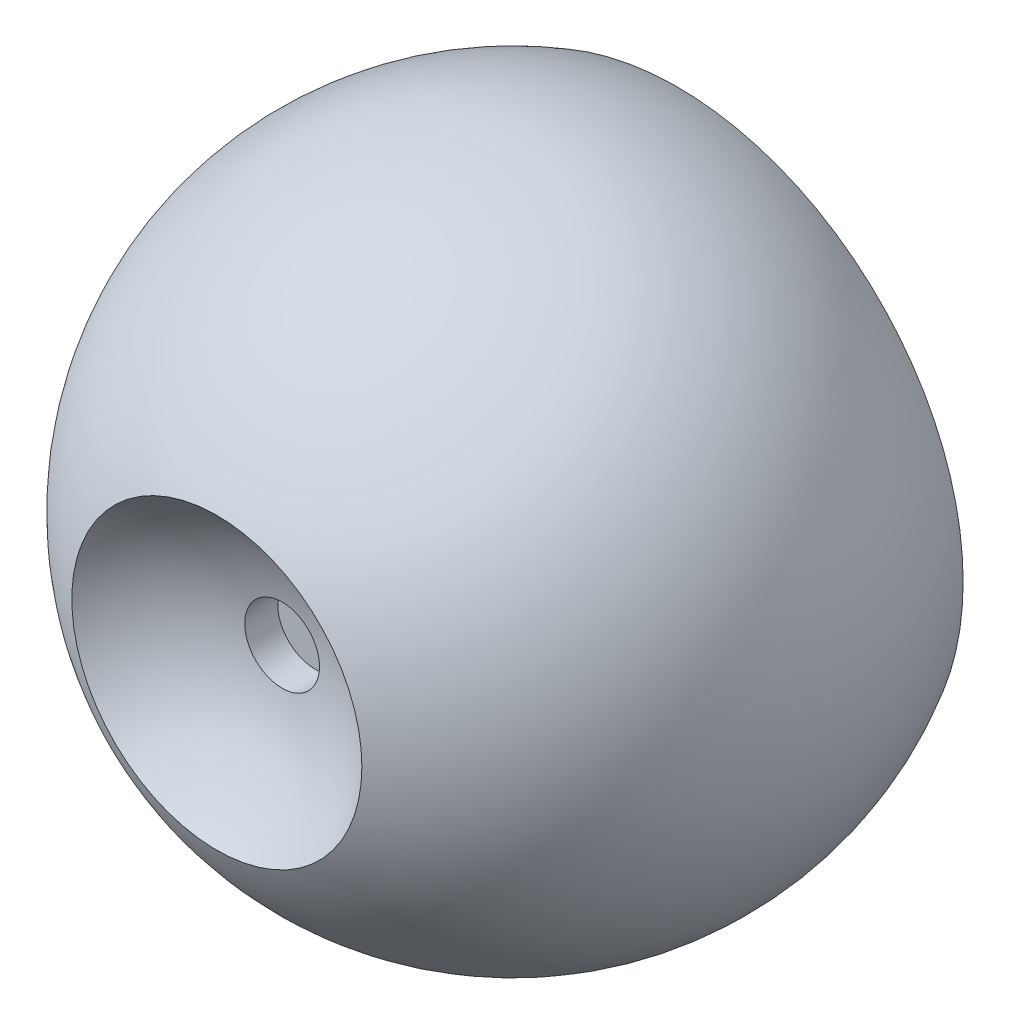
ISO-10303-21;
HEADER;
FILE_DESCRIPTION(('STEP AP214'),'2;1');
FILE_NAME('part.step','',(''),(''),'','','');
FILE_SCHEMA(('AUTOMOTIVE_DESIGN { 1 0 10303 214 1 1 1 1 }'));
ENDSEC;
DATA;
#1=APPLICATION_CONTEXT('core data for automotive mechanical design processes');
#2=APPLICATION_PROTOCOL_DEFINITION('international standard','automotive_design',2000,#1);
#3=PRODUCT_CONTEXT('',#1,'mechanical');
#4=PRODUCT('Part','Part','',(#3));
#5=PRODUCT_RELATED_PRODUCT_CATEGORY('part','',(#4));
#6=PRODUCT_DEFINITION_FORMATION('','',#4);
#7=PRODUCT_DEFINITION_CONTEXT('part definition',#1,'design');
#8=PRODUCT_DEFINITION('design','',#6,#7);
#9=PRODUCT_DEFINITION_SHAPE('','',#8);
#10=(LENGTH_UNIT() NAMED_UNIT(*) SI_UNIT(.MILLI.,.METRE.));
#11=(NAMED_UNIT(*) PLANE_ANGLE_UNIT() SI_UNIT($,.RADIAN.));
#12=(NAMED_UNIT(*) SI_UNIT($,.STERADIAN.) SOLID_ANGLE_UNIT());
#13=UNCERTAINTY_MEASURE_WITH_UNIT(LENGTH_MEASURE(1.E-05),#10,'distance_accuracy_value','');
#14=(GEOMETRIC_REPRESENTATION_CONTEXT(3) GLOBAL_UNCERTAINTY_ASSIGNED_CONTEXT((#13)) GLOBAL_UNIT_ASSIGNED_CONTEXT((#10,
#11,#12)) REPRESENTATION_CONTEXT('',''));
#15=CARTESIAN_POINT('',(0.,0.,0.));
#16=DIRECTION('',(0.,0.,1.));
#17=DIRECTION('',(1.,0.,0.));
#18=AXIS2_PLACEMENT_3D('',#15,#16,#17);
#19=CARTESIAN_POINT('',(-65.,12.9903810567666,-7.5));
#20=DIRECTION('',(0.,0.,1.));
#21=DIRECTION('',(1.,0.,0.));
#22=AXIS2_PLACEMENT_3D('',#19,#20,#21);
#23=PLANE('',#22);
#24=CARTESIAN_POINT('',(-65.,0.,-7.5));
#25=DIRECTION('',(0.,0.,1.));
#26=DIRECTION('',(0.,-1.,0.));
#27=AXIS2_PLACEMENT_3D('',#24,#25,#26);
#28=CIRCLE('',#27,11.9903800262387);
#29=CARTESIAN_POINT('',(-76.9743360660473,-0.620091657600614,-7.5));
#30=VERTEX_POINT('',#29);
#31=CARTESIAN_POINT('',(-76.9740808785671,0.625,-7.5));
#32=VERTEX_POINT('',#31);
#33=EDGE_CURVE('E11',#30,#32,#28,.T.);
#34=ORIENTED_EDGE('',*,*,#33,.T.);
#35=DIRECTION('',(1.,0.,0.));
#36=VECTOR('',#35,1.);
#37=CARTESIAN_POINT('',(-70.9870404392836,0.625,-7.5));
#38=LINE('',#37,#36);
#39=CARTESIAN_POINT('',(-76.3653810567666,0.625,-7.5));
#40=VERTEX_POINT('',#39);
#41=EDGE_CURVE('E23',#32,#40,#38,.T.);
#42=ORIENTED_EDGE('',*,*,#41,.T.);
#43=CARTESIAN_POINT('',(-76.3653810567666,0.,-7.5));
#44=DIRECTION('',(0.,0.,-1.));
#45=DIRECTION('',(1.,0.,0.));
#46=AXIS2_PLACEMENT_3D('',#43,#44,#45);
#47=CIRCLE('',#46,0.625);
#48=CARTESIAN_POINT('',(-76.3704395717132,-0.624979528805975,-7.5));
#49=VERTEX_POINT('',#48);
#50=EDGE_CURVE('E321',#40,#49,#47,.T.);
#51=ORIENTED_EDGE('',*,*,#50,.T.);
#52=DIRECTION('',(-0.999967246089555,0.00809362391456672,0.));
#53=VECTOR('',#52,1.);
#54=CARTESIAN_POINT('',(-70.740689205436,-0.670546103487024,-7.5));
#55=LINE('',#54,#53);
#56=EDGE_CURVE('E319',#49,#30,#55,.T.);
#57=ORIENTED_EDGE('',*,*,#56,.T.);
#58=EDGE_LOOP('',(#34,#42,#51,#57));
#59=FACE_BOUND('',#58,.T.);
#60=CARTESIAN_POINT('',(-65.,0.,-7.5));
#61=DIRECTION('',(0.,0.,-1.));
#62=DIRECTION('',(0.,-1.,0.));
#63=AXIS2_PLACEMENT_3D('',#60,#61,#62);
#64=CIRCLE('',#63,12.9903810567666);
#65=CARTESIAN_POINT('',(-52.0096189432334,0.,-7.5));
#66=VERTEX_POINT('',#65);
#67=EDGE_CURVE('E316',#66,#66,#64,.T.);
#68=ORIENTED_EDGE('',*,*,#67,.T.);
#69=EDGE_LOOP('',(#68));
#70=FACE_BOUND('',#69,.T.);
#71=ADVANCED_FACE('F16',(#59,#70),#23,.F.);
#72=CARTESIAN_POINT('',(-76.3903810567666,0.,6.67097884116496));
#73=DIRECTION('',(0.,0.,1.));
#74=DIRECTION('',(-1.,0.,0.));
#75=AXIS2_PLACEMENT_3D('',#72,#73,#74);
#76=PLANE('',#75);
#77=DIRECTION('',(-0.694658370458997,0.719339800338651,0.));
#78=VECTOR('',#77,1.);
#79=CARTESIAN_POINT('',(-73.3986844031218,8.69709229539268,6.67097884116497));
#80=LINE('',#79,#78);
#81=CARTESIAN_POINT('',(-73.3292185660759,8.62515831535883,6.67097884116496));
#82=VERTEX_POINT('',#81);
#83=CARTESIAN_POINT('',(-73.3621393631338,8.65924879866636,6.67097884116497));
#84=VERTEX_POINT('',#83);
#85=EDGE_CURVE('E313',#82,#84,#80,.T.);
#86=ORIENTED_EDGE('',*,*,#85,.F.);
#87=CARTESIAN_POINT('',(-65.,0.,6.67097884116498));
#88=DIRECTION('',(0.,0.,1.));
#89=DIRECTION('',(1.,0.,0.));
#90=AXIS2_PLACEMENT_3D('',#87,#88,#89);
#91=CIRCLE('',#90,11.9903800262387);
#92=CARTESIAN_POINT('',(-73.3292185660759,-8.62515831535882,6.67097884116496));
#93=VERTEX_POINT('',#92);
#94=EDGE_CURVE('E310',#82,#93,#91,.T.);
#95=ORIENTED_EDGE('',*,*,#94,.T.);
#96=DIRECTION('',(0.694658370458997,0.719339800338651,0.));
#97=VECTOR('',#96,1.);
#98=CARTESIAN_POINT('',(-73.3986844031218,-8.69709229539268,6.67097884116497));
#99=LINE('',#98,#97);
#100=CARTESIAN_POINT('',(-73.3621393631337,-8.65924879866634,6.67097884116497));
#101=VERTEX_POINT('',#100);
#102=EDGE_CURVE('E307',#101,#93,#99,.T.);
#103=ORIENTED_EDGE('',*,*,#102,.F.);
#104=CARTESIAN_POINT('',(-65.,0.,6.67097884116498));
#105=DIRECTION('',(0.,0.,1.));
#106=DIRECTION('',(1.,0.,0.));
#107=AXIS2_PLACEMENT_3D('',#104,#105,#106);
#108=CIRCLE('',#107,12.0377724054608);
#109=EDGE_CURVE('E304',#84,#101,#108,.T.);
#110=ORIENTED_EDGE('',*,*,#109,.F.);
#111=EDGE_LOOP('',(#86,#95,#103,#110));
#112=FACE_BOUND('',#111,.T.);
#113=ADVANCED_FACE('F347',(#112),#76,.F.);
#114=CARTESIAN_POINT('',(-73.3986844031218,-8.69709229539268,2.99773421907535));
#115=DIRECTION('',(0.719339800338651,-0.694658370458997,0.));
#116=DIRECTION('',(0.694658370458997,0.719339800338651,0.));
#117=AXIS2_PLACEMENT_3D('',#114,#115,#116);
#118=PLANE('',#117);
#119=DIRECTION('',(0.,0.,-1.));
#120=VECTOR('',#119,1.);
#121=CARTESIAN_POINT('',(-73.3292178502111,-8.6251575740591,-0.199999999999988));
#122=LINE('',#121,#120);
#123=CARTESIAN_POINT('',(-73.3292185660759,-8.62515831535883,-0.675510403014281));
#124=VERTEX_POINT('',#123);
#125=EDGE_CURVE('E302',#93,#124,#122,.T.);
#126=ORIENTED_EDGE('',*,*,#125,.T.);
#127=DIRECTION('',(-0.694658370458997,-0.719339800338651,0.));
#128=VECTOR('',#127,1.);
#129=CARTESIAN_POINT('',(-72.9124235438005,-8.19355443515563,-0.675510403014277));
#130=LINE('',#129,#128);
#131=CARTESIAN_POINT('',(-73.8849452624431,-9.20063015562975,-0.675510403014262));
#132=VERTEX_POINT('',#131);
#133=EDGE_CURVE('E300',#124,#132,#130,.T.);
#134=ORIENTED_EDGE('',*,*,#133,.T.);
#135=DIRECTION('',(0.,0.,1.));
#136=VECTOR('',#135,1.);
#137=CARTESIAN_POINT('',(-73.8849452624431,-9.20063015562975,0.262244785081824));
#138=LINE('',#137,#136);
#139=CARTESIAN_POINT('',(-73.8849452624431,-9.20063015562974,1.19999997317793));
#140=VERTEX_POINT('',#139);
#141=EDGE_CURVE('E298',#132,#140,#138,.T.);
#142=ORIENTED_EDGE('',*,*,#141,.T.);
#143=DIRECTION('',(0.0946683023178728,0.0980318968052485,0.99067030829889));
#144=VECTOR('',#143,1.);
#145=CARTESIAN_POINT('',(-73.8849452624431,-9.20063015562974,1.19999997317792));
#146=LINE('',#145,#144);
#147=EDGE_CURVE('E295',#140,#101,#146,.T.);
#148=ORIENTED_EDGE('',*,*,#147,.T.);
#149=ORIENTED_EDGE('',*,*,#102,.T.);
#150=EDGE_LOOP('',(#126,#134,#142,#148,#149));
#151=FACE_BOUND('',#150,.T.);
#152=ADVANCED_FACE('F351',(#151),#118,.F.);
#153=CARTESIAN_POINT('',(-77.7903810567666,0.,-0.67551040301428));
#154=DIRECTION('',(0.,0.,1.));
#155=DIRECTION('',(1.,0.,0.));
#156=AXIS2_PLACEMENT_3D('',#153,#154,#155);
#157=PLANE('',#156);
#158=ORIENTED_EDGE('',*,*,#133,.F.);
#159=CARTESIAN_POINT('',(-65.,0.,-0.675510403014266));
#160=DIRECTION('',(0.,0.,-1.));
#161=DIRECTION('',(1.,0.,0.));
#162=AXIS2_PLACEMENT_3D('',#159,#160,#161);
#163=CIRCLE('',#162,11.9903800262387);
#164=CARTESIAN_POINT('',(-73.3292185660759,8.62515831535883,-0.675510403014284));
#165=VERTEX_POINT('',#164);
#166=EDGE_CURVE('E293',#124,#165,#163,.T.);
#167=ORIENTED_EDGE('',*,*,#166,.T.);
#168=DIRECTION('',(0.694658370458997,-0.719339800338651,0.));
#169=VECTOR('',#168,1.);
#170=CARTESIAN_POINT('',(-72.9124235438005,8.19355443515563,-0.675510403014277));
#171=LINE('',#170,#169);
#172=CARTESIAN_POINT('',(-73.8849452624431,9.20063015562975,-0.675510403014262));
#173=VERTEX_POINT('',#172);
#174=EDGE_CURVE('E290',#173,#165,#171,.T.);
#175=ORIENTED_EDGE('',*,*,#174,.F.);
#176=CARTESIAN_POINT('',(-65.,0.,-0.675510403014266));
#177=DIRECTION('',(0.,0.,-1.));
#178=DIRECTION('',(1.,0.,0.));
#179=AXIS2_PLACEMENT_3D('',#176,#177,#178);
#180=CIRCLE('',#179,12.7903810567666);
#181=EDGE_CURVE('E287',#132,#173,#180,.T.);
#182=ORIENTED_EDGE('',*,*,#181,.F.);
#183=EDGE_LOOP('',(#158,#167,#175,#182));
#184=FACE_BOUND('',#183,.T.);
#185=ADVANCED_FACE('F357',(#184),#157,.T.);
#186=CARTESIAN_POINT('',(-73.3986844031218,8.69709229539268,2.99773421907535));
#187=DIRECTION('',(-0.719339800338651,-0.694658370458997,0.));
#188=DIRECTION('',(0.694658370458997,-0.719339800338651,0.));
#189=AXIS2_PLACEMENT_3D('',#186,#187,#188);
#190=PLANE('',#189);
#191=DIRECTION('',(0.,0.,1.));
#192=VECTOR('',#191,1.);
#193=CARTESIAN_POINT('',(-73.3292178502111,8.6251575740591,-0.199999999999994));
#194=LINE('',#193,#192);
#195=EDGE_CURVE('E284',#165,#82,#194,.T.);
#196=ORIENTED_EDGE('',*,*,#195,.T.);
#197=ORIENTED_EDGE('',*,*,#85,.T.);
#198=DIRECTION('',(-0.0946683023178728,0.0980318968052485,-0.99067030829889));
#199=VECTOR('',#198,1.);
#200=CARTESIAN_POINT('',(-73.8849452624431,9.20063015562974,1.19999997317792));
#201=LINE('',#200,#199);
#202=CARTESIAN_POINT('',(-73.8849452624431,9.20063015562974,1.19999997317793));
#203=VERTEX_POINT('',#202);
#204=EDGE_CURVE('E282',#84,#203,#201,.T.);
#205=ORIENTED_EDGE('',*,*,#204,.T.);
#206=DIRECTION('',(0.,0.,-1.));
#207=VECTOR('',#206,1.);
#208=CARTESIAN_POINT('',(-73.8849452624431,9.20063015562975,0.262244785081824));
#209=LINE('',#208,#207);
#210=EDGE_CURVE('E279',#203,#173,#209,.T.);
#211=ORIENTED_EDGE('',*,*,#210,.T.);
#212=ORIENTED_EDGE('',*,*,#174,.T.);
#213=EDGE_LOOP('',(#196,#197,#205,#211,#212));
#214=FACE_BOUND('',#213,.T.);
#215=ADVANCED_FACE('F419',(#214),#190,.T.);
#216=CARTESIAN_POINT('',(-59.1384669512355,-10.5744855390729,2.99773421907536));
#217=DIRECTION('',(0.874619707139396,0.484809620246337,0.));
#218=DIRECTION('',(-0.484809620246337,0.874619707139396,0.));
#219=AXIS2_PLACEMENT_3D('',#216,#217,#218);
#220=PLANE('',#219);
#221=DIRECTION('',(0.,0.,1.));
#222=VECTOR('',#221,1.);
#223=CARTESIAN_POINT('',(-59.18694841287,-10.487022667039,-0.199999999999989));
#224=LINE('',#223,#222);
#225=CARTESIAN_POINT('',(-59.18694841287,-10.487022667039,-0.67600000004451));
#226=VERTEX_POINT('',#225);
#227=CARTESIAN_POINT('',(-59.1869479132601,-10.4870235683589,6.67097884116497));
#228=VERTEX_POINT('',#227);
#229=EDGE_CURVE('E275',#226,#228,#224,.T.);
#230=ORIENTED_EDGE('',*,*,#229,.T.);
#231=DIRECTION('',(0.484809620246337,-0.874619707139396,0.));
#232=VECTOR('',#231,1.);
#233=CARTESIAN_POINT('',(-63.407833152575,-2.87234502711466,6.67097884116498));
#234=LINE('',#233,#232);
#235=CARTESIAN_POINT('',(-59.1639721314967,-10.5284729758749,6.67097884116499));
#236=VERTEX_POINT('',#235);
#237=EDGE_CURVE('E271',#228,#236,#234,.T.);
#238=ORIENTED_EDGE('',*,*,#237,.T.);
#239=DIRECTION('',(0.0660700362190535,-0.119193500531683,-0.990670308298889));
#240=VECTOR('',#239,1.);
#241=CARTESIAN_POINT('',(-58.9815361742799,-10.8575961549727,3.93548940717147));
#242=LINE('',#241,#240);
#243=CARTESIAN_POINT('',(-58.7991002170631,-11.1867193340705,1.19999997317794));
#244=VERTEX_POINT('',#243);
#245=EDGE_CURVE('E267',#236,#244,#242,.T.);
#246=ORIENTED_EDGE('',*,*,#245,.T.);
#247=DIRECTION('',(0.,0.,-1.));
#248=VECTOR('',#247,1.);
#249=CARTESIAN_POINT('',(-58.7991002170631,-11.1867193340705,0.262244785081843));
#250=LINE('',#249,#248);
#251=CARTESIAN_POINT('',(-58.799100217063,-11.1867193340705,-0.67600000004451));
#252=VERTEX_POINT('',#251);
#253=EDGE_CURVE('E265',#244,#252,#250,.T.);
#254=ORIENTED_EDGE('',*,*,#253,.T.);
#255=DIRECTION('',(0.484809620246337,-0.874619707139396,0.));
#256=VECTOR('',#255,1.);
#257=CARTESIAN_POINT('',(-59.1384669512355,-10.5744855390729,-0.67600000004451));
#258=LINE('',#257,#256);
#259=EDGE_CURVE('E263',#252,#226,#258,.F.);
#260=ORIENTED_EDGE('',*,*,#259,.T.);
#261=EDGE_LOOP('',(#230,#238,#246,#254,#260));
#262=FACE_BOUND('',#261,.T.);
#263=ADVANCED_FACE('F449',(#262),#220,.T.);
#264=CARTESIAN_POINT('',(-76.3903810567666,0.,6.67097884116496));
#265=DIRECTION('',(0.,0.,1.));
#266=DIRECTION('',(-1.,0.,0.));
#267=AXIS2_PLACEMENT_3D('',#264,#265,#266);
#268=PLANE('',#267);
#269=CARTESIAN_POINT('',(-53.662871982313,-3.90368623188954,6.67097884116498));
#270=VERTEX_POINT('',#269);
#271=EDGE_CURVE('E260',#228,#270,#91,.T.);
#272=ORIENTED_EDGE('',*,*,#271,.T.);
#273=DIRECTION('',(0.945518575599317,-0.325568154457157,0.));
#274=VECTOR('',#273,1.);
#275=CARTESIAN_POINT('',(-53.6180625817999,-3.91911534582118,6.67097884116499));
#276=LINE('',#275,#274);
#277=CARTESIAN_POINT('',(-53.6180625817999,-3.91911534582118,6.67097884116499));
#278=VERTEX_POINT('',#277);
#279=EDGE_CURVE('E256',#270,#278,#276,.T.);
#280=ORIENTED_EDGE('',*,*,#279,.T.);
#281=CARTESIAN_POINT('',(-65.,0.,6.67097884116498));
#282=DIRECTION('',(0.,0.,1.));
#283=DIRECTION('',(-1.,0.,0.));
#284=AXIS2_PLACEMENT_3D('',#281,#282,#283);
#285=CIRCLE('',#284,12.0377724054609);
#286=EDGE_CURVE('E253',#236,#278,#285,.T.);
#287=ORIENTED_EDGE('',*,*,#286,.F.);
#288=ORIENTED_EDGE('',*,*,#237,.F.);
#289=EDGE_LOOP('',(#272,#280,#287,#288));
#290=FACE_BOUND('',#289,.T.);
#291=ADVANCED_FACE('F431',(#290),#268,.F.);
#292=CARTESIAN_POINT('',(-53.5683201247531,-3.93624304733526,2.99773421907537));
#293=DIRECTION('',(0.325568154457157,0.945518575599317,0.));
#294=DIRECTION('',(-0.945518575599317,0.325568154457157,0.));
#295=AXIS2_PLACEMENT_3D('',#292,#293,#294);
#296=PLANE('',#295);
#297=DIRECTION('',(0.,0.,-1.));
#298=VECTOR('',#297,1.);
#299=CARTESIAN_POINT('',(-53.6628729566963,-3.90368589638248,-0.199999999999994));
#300=LINE('',#299,#298);
#301=CARTESIAN_POINT('',(-53.6628729566963,-3.90368589638248,-0.676000000044512));
#302=VERTEX_POINT('',#301);
#303=EDGE_CURVE('E251',#270,#302,#300,.T.);
#304=ORIENTED_EDGE('',*,*,#303,.T.);
#305=DIRECTION('',(0.945518575599317,-0.325568154457157,0.));
#306=VECTOR('',#305,1.);
#307=CARTESIAN_POINT('',(-53.5683201247531,-3.93624304733526,-0.676000000044512));
#308=LINE('',#307,#306);
#309=CARTESIAN_POINT('',(-52.9064571218336,-4.16414075545528,-0.676000000044512));
#310=VERTEX_POINT('',#309);
#311=EDGE_CURVE('E246',#310,#302,#308,.F.);
#312=ORIENTED_EDGE('',*,*,#311,.F.);
#313=DIRECTION('',(0.,0.,-1.));
#314=VECTOR('',#313,1.);
#315=CARTESIAN_POINT('',(-52.9064571218336,-4.16414075545527,-0.675510403014253));
#316=LINE('',#315,#314);
#317=CARTESIAN_POINT('',(-52.9064571218336,-4.16414075545527,1.19999997317795));
#318=VERTEX_POINT('',#317);
#319=EDGE_CURVE('E241',#318,#310,#316,.T.);
#320=ORIENTED_EDGE('',*,*,#319,.F.);
#321=DIRECTION('',(0.128855624820094,-0.0443685497532511,-0.990670308298889));
#322=VECTOR('',#321,1.);
#323=CARTESIAN_POINT('',(-52.9064571218336,-4.16414075545527,1.19999997317795));
#324=LINE('',#323,#322);
#325=EDGE_CURVE('E238',#278,#318,#324,.T.);
#326=ORIENTED_EDGE('',*,*,#325,.F.);
#327=ORIENTED_EDGE('',*,*,#279,.F.);
#328=EDGE_LOOP('',(#304,#312,#320,#326,#327));
#329=FACE_BOUND('',#328,.T.);
#330=ADVANCED_FACE('F437',(#329),#296,.F.);
#331=CARTESIAN_POINT('',(-65.3471815893001,-2.25319037755906E-13,-0.676000000044512));
#332=DIRECTION('',(0.,0.,1.));
#333=DIRECTION('',(0.999992309572483,0.00392183578081065,0.));
#334=AXIS2_PLACEMENT_3D('',#331,#332,#333);
#335=PLANE('',#334);
#336=CARTESIAN_POINT('',(-65.,0.,-0.676000000044512));
#337=DIRECTION('',(0.,0.,1.));
#338=DIRECTION('',(0.,-1.,0.));
#339=AXIS2_PLACEMENT_3D('',#336,#337,#338);
#340=CIRCLE('',#339,11.9903800262387);
#341=EDGE_CURVE('E236',#302,#226,#340,.F.);
#342=ORIENTED_EDGE('',*,*,#341,.T.);
#343=ORIENTED_EDGE('',*,*,#259,.F.);
#344=CARTESIAN_POINT('',(-65.,0.,-0.676000000044512));
#345=DIRECTION('',(0.,0.,1.));
#346=DIRECTION('',(0.,-1.,0.));
#347=AXIS2_PLACEMENT_3D('',#344,#345,#346);
#348=CIRCLE('',#347,12.7903810567666);
#349=EDGE_CURVE('E233',#252,#310,#348,.T.);
#350=ORIENTED_EDGE('',*,*,#349,.T.);
#351=ORIENTED_EDGE('',*,*,#311,.T.);
#352=EDGE_LOOP('',(#342,#343,#350,#351));
#353=FACE_BOUND('',#352,.T.);
#354=ADVANCED_FACE('F442',(#353),#335,.T.);
#355=CARTESIAN_POINT('',(-59.1384669512355,10.5744855390729,2.99773421907536));
#356=DIRECTION('',(-0.874619707139396,0.484809620246337,0.));
#357=DIRECTION('',(-0.484809620246337,-0.874619707139396,0.));
#358=AXIS2_PLACEMENT_3D('',#355,#356,#357);
#359=PLANE('',#358);
#360=DIRECTION('',(0.,0.,-1.));
#361=VECTOR('',#360,1.);
#362=CARTESIAN_POINT('',(-59.18694841287,10.487022667039,-0.199999999999996));
#363=LINE('',#362,#361);
#364=CARTESIAN_POINT('',(-59.1869479132601,10.4870235683589,6.67097884116497));
#365=VERTEX_POINT('',#364);
#366=CARTESIAN_POINT('',(-59.18694841287,10.487022667039,-0.676000000044517));
#367=VERTEX_POINT('',#366);
#368=EDGE_CURVE('E231',#365,#367,#363,.T.);
#369=ORIENTED_EDGE('',*,*,#368,.T.);
#370=DIRECTION('',(-0.484809620246337,-0.874619707139396,0.));
#371=VECTOR('',#370,1.);
#372=CARTESIAN_POINT('',(-65.0816016884715,-0.147213342913416,-0.676000000044512));
#373=LINE('',#372,#371);
#374=CARTESIAN_POINT('',(-58.799100217063,11.1867193340705,-0.676000000044517));
#375=VERTEX_POINT('',#374);
#376=EDGE_CURVE('E228',#375,#367,#373,.T.);
#377=ORIENTED_EDGE('',*,*,#376,.F.);
#378=DIRECTION('',(0.,0.,-1.));
#379=VECTOR('',#378,1.);
#380=CARTESIAN_POINT('',(-58.7991002170631,11.1867193340705,0.262244785081843));
#381=LINE('',#380,#379);
#382=CARTESIAN_POINT('',(-58.7991002170631,11.1867193340705,1.19999997317792));
#383=VERTEX_POINT('',#382);
#384=EDGE_CURVE('E225',#383,#375,#381,.T.);
#385=ORIENTED_EDGE('',*,*,#384,.F.);
#386=DIRECTION('',(0.0660700362190535,0.119193500531683,-0.990670308298889));
#387=VECTOR('',#386,1.);
#388=CARTESIAN_POINT('',(-58.9815361742799,10.8575961549727,3.93548940717147));
#389=LINE('',#388,#387);
#390=CARTESIAN_POINT('',(-59.1639721314967,10.5284729758749,6.67097884116499));
#391=VERTEX_POINT('',#390);
#392=EDGE_CURVE('E222',#391,#383,#389,.T.);
#393=ORIENTED_EDGE('',*,*,#392,.F.);
#394=DIRECTION('',(0.484809620246337,0.874619707139396,0.));
#395=VECTOR('',#394,1.);
#396=CARTESIAN_POINT('',(-67.6771993539145,-4.82979548484356,6.67097884116497));
#397=LINE('',#396,#395);
#398=EDGE_CURVE('E219',#365,#391,#397,.T.);
#399=ORIENTED_EDGE('',*,*,#398,.F.);
#400=EDGE_LOOP('',(#369,#377,#385,#393,#399));
#401=FACE_BOUND('',#400,.T.);
#402=ADVANCED_FACE('F383',(#401),#359,.F.);
#403=CARTESIAN_POINT('',(-65.3471815893001,-2.25319037755906E-13,-0.676000000044512));
#404=DIRECTION('',(0.,0.,1.));
#405=DIRECTION('',(0.999992309572483,0.00392183578081065,0.));
#406=AXIS2_PLACEMENT_3D('',#403,#404,#405);
#407=PLANE('',#406);
#408=CARTESIAN_POINT('',(-53.6628729566963,3.90368589638248,-0.676000000044515));
#409=VERTEX_POINT('',#408);
#410=EDGE_CURVE('E218',#367,#409,#340,.F.);
#411=ORIENTED_EDGE('',*,*,#410,.T.);
#412=DIRECTION('',(-0.945518575599317,-0.325568154457157,0.));
#413=VECTOR('',#412,1.);
#414=CARTESIAN_POINT('',(-65.3103822075615,-0.106873164737228,-0.676000000044512));
#415=LINE('',#414,#413);
#416=CARTESIAN_POINT('',(-52.9064571218336,4.16414075545527,-0.676000000044515));
#417=VERTEX_POINT('',#416);
#418=EDGE_CURVE('E215',#417,#409,#415,.T.);
#419=ORIENTED_EDGE('',*,*,#418,.F.);
#420=CARTESIAN_POINT('',(-65.,0.,-0.676000000044512));
#421=DIRECTION('',(0.,0.,1.));
#422=DIRECTION('',(0.,-1.,0.));
#423=AXIS2_PLACEMENT_3D('',#420,#421,#422);
#424=CIRCLE('',#423,12.7903810567666);
#425=EDGE_CURVE('E212',#375,#417,#424,.F.);
#426=ORIENTED_EDGE('',*,*,#425,.F.);
#427=ORIENTED_EDGE('',*,*,#376,.T.);
#428=EDGE_LOOP('',(#411,#419,#426,#427));
#429=FACE_BOUND('',#428,.T.);
#430=ADVANCED_FACE('F371',(#429),#407,.T.);
#431=CARTESIAN_POINT('',(-53.5683201247531,3.93624304733526,2.99773421907537));
#432=DIRECTION('',(-0.325568154457157,0.945518575599317,0.));
#433=DIRECTION('',(-0.945518575599317,-0.325568154457157,0.));
#434=AXIS2_PLACEMENT_3D('',#431,#432,#433);
#435=PLANE('',#434);
#436=DIRECTION('',(0.,0.,1.));
#437=VECTOR('',#436,1.);
#438=CARTESIAN_POINT('',(-53.6628729566963,3.90368589638248,-0.199999999999994));
#439=LINE('',#438,#437);
#440=CARTESIAN_POINT('',(-53.662871982313,3.90368623188955,6.67097884116499));
#441=VERTEX_POINT('',#440);
#442=EDGE_CURVE('E210',#409,#441,#439,.T.);
#443=ORIENTED_EDGE('',*,*,#442,.T.);
#444=DIRECTION('',(0.945518575599317,0.325568154457157,0.));
#445=VECTOR('',#444,1.);
#446=CARTESIAN_POINT('',(-53.5683201247531,3.93624304733526,6.67097884116499));
#447=LINE('',#446,#445);
#448=CARTESIAN_POINT('',(-53.6180625817999,3.91911534582119,6.67097884116499));
#449=VERTEX_POINT('',#448);
#450=EDGE_CURVE('E208',#441,#449,#447,.T.);
#451=ORIENTED_EDGE('',*,*,#450,.T.);
#452=DIRECTION('',(0.128855624820094,0.0443685497532511,-0.990670308298889));
#453=VECTOR('',#452,1.);
#454=CARTESIAN_POINT('',(-52.9064571218336,4.16414075545527,1.19999997317795));
#455=LINE('',#454,#453);
#456=CARTESIAN_POINT('',(-52.9064571218336,4.16414075545527,1.19999997317796));
#457=VERTEX_POINT('',#456);
#458=EDGE_CURVE('E206',#449,#457,#455,.T.);
#459=ORIENTED_EDGE('',*,*,#458,.T.);
#460=DIRECTION('',(0.,0.,-1.));
#461=VECTOR('',#460,1.);
#462=CARTESIAN_POINT('',(-52.9064571218336,4.16414075545528,0.262244785081849));
#463=LINE('',#462,#461);
#464=EDGE_CURVE('E203',#457,#417,#463,.T.);
#465=ORIENTED_EDGE('',*,*,#464,.T.);
#466=ORIENTED_EDGE('',*,*,#418,.T.);
#467=EDGE_LOOP('',(#443,#451,#459,#465,#466));
#468=FACE_BOUND('',#467,.T.);
#469=ADVANCED_FACE('F362',(#468),#435,.T.);
#470=EDGE_CURVE('E202',#441,#365,#91,.T.);
#471=ORIENTED_EDGE('',*,*,#470,.T.);
#472=ORIENTED_EDGE('',*,*,#398,.T.);
#473=CARTESIAN_POINT('',(-65.,0.,6.67097884116498));
#474=DIRECTION('',(0.,0.,-1.));
#475=DIRECTION('',(1.,0.,0.));
#476=AXIS2_PLACEMENT_3D('',#473,#474,#475);
#477=CIRCLE('',#476,12.0377724054608);
#478=EDGE_CURVE('E199',#391,#449,#477,.T.);
#479=ORIENTED_EDGE('',*,*,#478,.T.);
#480=ORIENTED_EDGE('',*,*,#450,.F.);
#481=EDGE_LOOP('',(#471,#472,#479,#480));
#482=FACE_BOUND('',#481,.T.);
#483=ADVANCED_FACE('F353',(#482),#76,.F.);
#484=CARTESIAN_POINT('',(-65.,0.,0.));
#485=DIRECTION('',(0.,0.,-1.));
#486=DIRECTION('',(1.,0.,0.));
#487=AXIS2_PLACEMENT_3D('',#484,#485,#486);
#488=SPHERICAL_SURFACE('',#487,15.);
#489=CARTESIAN_POINT('',(-65.,0.,13.4699665923862));
#490=DIRECTION('',(0.,0.,-1.));
#491=DIRECTION('',(1.,0.,0.));
#492=AXIS2_PLACEMENT_3D('',#489,#490,#491);
#493=CIRCLE('',#492,6.6);
#494=CARTESIAN_POINT('',(-58.4,0.,13.4699665923862));
#495=VERTEX_POINT('',#494);
#496=EDGE_CURVE('E196',#495,#495,#493,.T.);
#497=CARTESIAN_POINT('',(-58.4,0.,13.4699665923862));
#498=CARTESIAN_POINT('',(-58.1700539575794,0.,13.3573047414652));
#499=CARTESIAN_POINT('',(-57.9429987172798,0.,13.2387442852734));
#500=CARTESIAN_POINT('',(-57.4952520500929,0.,12.9901607487931));
#501=CARTESIAN_POINT('',(-57.2745606232055,0.,12.8601376685046));
#502=CARTESIAN_POINT('',(-56.840123792013,0.,12.5889634702762));
#503=CARTESIAN_POINT('',(-56.6263783877078,0.,12.4478123523363));
#504=CARTESIAN_POINT('',(-56.2063931262271,0.,12.1547538981026));
#505=CARTESIAN_POINT('',(-56.0001532690517,0.,12.002846561809));
#506=CARTESIAN_POINT('',(-55.5957201438731,0.,11.6886735364648));
#507=CARTESIAN_POINT('',(-55.3975268758699,0.,11.5264078474144));
#508=CARTESIAN_POINT('',(-55.0097065508124,0.,11.1919437213832));
#509=CARTESIAN_POINT('',(-54.8200794937581,0.,11.0197452844025));
#510=CARTESIAN_POINT('',(-54.449888836625,0.,10.6658671574143));
#511=CARTESIAN_POINT('',(-54.2693252365463,0.,10.4841874674068));
#512=CARTESIAN_POINT('',(-53.9177349507305,0.,10.1118232319135));
#513=CARTESIAN_POINT('',(-53.7467082649933,0.,9.92113868642785));
#514=CARTESIAN_POINT('',(-53.41464026432,0.,9.53126473835495));
#515=CARTESIAN_POINT('',(-53.2535989493838,0.,9.33207533576776));
#516=CARTESIAN_POINT('',(-52.9419239621211,0.,8.92571397573735));
#517=CARTESIAN_POINT('',(-52.7912902897946,0.,8.71854201829415));
#518=CARTESIAN_POINT('',(-52.5008255697537,0.,8.29675878133953));
#519=CARTESIAN_POINT('',(-52.3609945220393,0.,8.08214750182811));
#520=CARTESIAN_POINT('',(-52.09250170716,0.,7.64604836064979));
#521=CARTESIAN_POINT('',(-51.9638399399952,0.,7.42456049898289));
#522=CARTESIAN_POINT('',(-51.7180230548166,0.,6.97528896467958));
#523=CARTESIAN_POINT('',(-51.6008679368028,0.,6.74750529204317));
#524=CARTESIAN_POINT('',(-51.3783715465256,0.,6.28623941547203));
#525=CARTESIAN_POINT('',(-51.2730302742621,0.,6.05275721153729));
#526=CARTESIAN_POINT('',(-51.0744377945817,0.,5.58070649435807));
#527=CARTESIAN_POINT('',(-50.9811865871648,0.,5.3421379811136));
#528=CARTESIAN_POINT('',(-50.8070187544845,0.,4.86054020429714));
#529=CARTESIAN_POINT('',(-50.7261021292211,0.,4.61751094072516));
#530=CARTESIAN_POINT('',(-50.5768156352082,0.,4.12762891892766));
#531=CARTESIAN_POINT('',(-50.5084457664587,0.,3.88077616070214));
#532=CARTESIAN_POINT('',(-50.3844320605377,0.,3.38389443099291));
#533=CARTESIAN_POINT('',(-50.3287882233661,0.,3.13386545950918));
#534=CARTESIAN_POINT('',(-50.2303724862854,0.,2.6312869131407));
#535=CARTESIAN_POINT('',(-50.1876005863761,0.,2.37873733825594));
#536=CARTESIAN_POINT('',(-50.1150408775387,0.,1.87177980430582));
#537=CARTESIAN_POINT('',(-50.0852530686106,0.,1.61737184524045));
#538=CARTESIAN_POINT('',(-50.0387396494119,0.,1.10736463508691));
#539=CARTESIAN_POINT('',(-50.0220140391412,0.,0.851765383998731));
#540=CARTESIAN_POINT('',(-50.0016688740624,0.,0.34004580567856));
#541=CARTESIAN_POINT('',(-49.9980493192543,0.,0.0839254784465632));
#542=CARTESIAN_POINT('',(-50.0039257561101,0.,-0.42816466992014));
#543=CARTESIAN_POINT('',(-50.013421747774,0.,-0.684134491054847));
#544=CARTESIAN_POINT('',(-50.0455043776245,0.,-1.19525243974462));
#545=CARTESIAN_POINT('',(-50.0680910158111,0.,-1.45040056729969));
#546=CARTESIAN_POINT('',(-50.1262957141213,0.,-1.95920609552414));
#547=CARTESIAN_POINT('',(-50.161913774245,0.,-2.21286349619352));
#548=CARTESIAN_POINT('',(-50.246087918653,0.,-2.71802244777975));
#549=CARTESIAN_POINT('',(-50.2946440029375,0.,-2.9695239986966));
#550=CARTESIAN_POINT('',(-50.4045668839674,0.,-3.46971177505201));
#551=CARTESIAN_POINT('',(-50.4659336807129,0.,-3.71839800049056));
#552=CARTESIAN_POINT('',(-50.6013170412571,0.,-4.21230305393426));
#553=CARTESIAN_POINT('',(-50.675333605056,0.,-4.4575218819394));
#554=CARTESIAN_POINT('',(-50.8358225426987,0.,-4.94384907991411));
#555=CARTESIAN_POINT('',(-50.9222949165426,0.,-5.18495744988369));
#556=CARTESIAN_POINT('',(-51.1074682675141,0.,-5.66243175029027));
#557=CARTESIAN_POINT('',(-51.2061692446417,0.,-5.89879768072726));
#558=CARTESIAN_POINT('',(-51.4155427282831,0.,-6.36616643281633));
#559=CARTESIAN_POINT('',(-51.526215234797,0.,-6.5971692544684));
#560=CARTESIAN_POINT('',(-51.7592351095932,0.,-7.05320937390526));
#561=CARTESIAN_POINT('',(-51.8815824778756,0.,-7.27824667169004));
#562=CARTESIAN_POINT('',(-52.0096189432334,0.,-7.5));
#563=B_SPLINE_CURVE_WITH_KNOTS('',3,(#497,#498,#499,#500,#501,#502,#503,#504,#505,#506,#507,
#508,#509,#510,#511,#512,#513,#514,#515,#516,#517,#518,#519,#520,#521,#522,#523,#524,#525,#526,
#527,#528,#529,#530,#531,#532,#533,#534,#535,#536,#537,#538,#539,#540,#541,#542,#543,#544,#545,
#546,#547,#548,#549,#550,#551,#552,#553,#554,#555,#556,#557,#558,#559,#560,#561,#562),
.UNSPECIFIED.,.F.,.F.,(4,2,2,2,2,2,2,2,2,2,2,2,2,2,2,2,2,2,2,2,2,2,2,2,2,2,2,2,2,2,2,2,4),(0.,
0.768101881858354,1.53620376371671,2.30430564557506,3.07240752743341,3.84050940929176,
4.60861129115012,5.37671317300847,6.14481505486682,6.91291693672518,7.68101881858353,
8.44912070044189,9.21722258230024,9.98532446415859,10.7534263460169,11.5215282278753,
12.2896301097337,13.057731991592,13.8258338734504,14.5939357553087,15.3620376371671,
16.1301395190254,16.8982414008838,17.6663432827421,18.4344451646005,19.2025470464588,
19.9706489283172,20.7387508101755,21.5068526920339,22.2749545738922,23.0430564557506,
23.811158337609,24.5792602194673),.UNSPECIFIED.);
#564=EDGE_CURVE('BSEAM361',#495,#66,#563,.T.);
#565=ORIENTED_EDGE('',*,*,#496,.T.);
#566=ORIENTED_EDGE('',*,*,#67,.F.);
#567=ORIENTED_EDGE('',*,*,#564,.T.);
#568=ORIENTED_EDGE('',*,*,#564,.F.);
#569=EDGE_LOOP('',(#565,#567,#566,#568));
#570=FACE_BOUND('',#569,.T.);
#571=ADVANCED_FACE('F361',(#570),#488,.T.);
#572=CARTESIAN_POINT('',(-65.,0.,3.93548940717146));
#573=DIRECTION('',(0.,0.,-1.));
#574=DIRECTION('',(-1.,0.,0.));
#575=AXIS2_PLACEMENT_3D('',#572,#573,#574);
#576=CONICAL_SURFACE('',#575,12.4140767311137,0.136705779640892);
#577=CARTESIAN_POINT('',(-65.,0.,1.19999997317765));
#578=DIRECTION('',(0.,0.,-1.));
#579=DIRECTION('',(-1.,0.,0.));
#580=AXIS2_PLACEMENT_3D('',#577,#578,#579);
#581=CIRCLE('',#580,12.7903810567666);
#582=EDGE_CURVE('E191',#140,#203,#581,.T.);
#583=ORIENTED_EDGE('',*,*,#582,.T.);
#584=ORIENTED_EDGE('',*,*,#204,.F.);
#585=ORIENTED_EDGE('',*,*,#109,.T.);
#586=ORIENTED_EDGE('',*,*,#147,.F.);
#587=EDGE_LOOP('',(#583,#584,#585,#586));
#588=FACE_BOUND('',#587,.T.);
#589=ADVANCED_FACE('F368',(#588),#576,.F.);
#590=CARTESIAN_POINT('',(-65.,0.,0.262244785081835));
#591=DIRECTION('',(0.,0.,1.));
#592=DIRECTION('',(-1.,0.,0.));
#593=AXIS2_PLACEMENT_3D('',#590,#591,#592);
#594=CYLINDRICAL_SURFACE('',#593,12.7903810567666);
#595=ORIENTED_EDGE('',*,*,#181,.T.);
#596=ORIENTED_EDGE('',*,*,#210,.F.);
#597=ORIENTED_EDGE('',*,*,#582,.F.);
#598=ORIENTED_EDGE('',*,*,#141,.F.);
#599=EDGE_LOOP('',(#595,#596,#597,#598));
#600=FACE_BOUND('',#599,.T.);
#601=ADVANCED_FACE('F402',(#600),#594,.F.);
#602=ORIENTED_EDGE('',*,*,#253,.F.);
#603=CARTESIAN_POINT('',(-65.,0.,1.19999997317794));
#604=DIRECTION('',(0.,0.,1.));
#605=DIRECTION('',(-1.,0.,0.));
#606=AXIS2_PLACEMENT_3D('',#603,#604,#605);
#607=CIRCLE('',#606,12.7903810567666);
#608=EDGE_CURVE('E188',#244,#318,#607,.T.);
#609=ORIENTED_EDGE('',*,*,#608,.T.);
#610=ORIENTED_EDGE('',*,*,#319,.T.);
#611=ORIENTED_EDGE('',*,*,#349,.F.);
#612=EDGE_LOOP('',(#602,#609,#610,#611));
#613=FACE_BOUND('',#612,.T.);
#614=ADVANCED_FACE('F403',(#613),#594,.F.);
#615=ORIENTED_EDGE('',*,*,#245,.F.);
#616=ORIENTED_EDGE('',*,*,#286,.T.);
#617=ORIENTED_EDGE('',*,*,#325,.T.);
#618=ORIENTED_EDGE('',*,*,#608,.F.);
#619=EDGE_LOOP('',(#615,#616,#617,#618));
#620=FACE_BOUND('',#619,.T.);
#621=ADVANCED_FACE('F394',(#620),#576,.F.);
#622=ORIENTED_EDGE('',*,*,#392,.T.);
#623=EDGE_CURVE('E187',#383,#457,#581,.T.);
#624=ORIENTED_EDGE('',*,*,#623,.T.);
#625=ORIENTED_EDGE('',*,*,#458,.F.);
#626=ORIENTED_EDGE('',*,*,#478,.F.);
#627=EDGE_LOOP('',(#622,#624,#625,#626));
#628=FACE_BOUND('',#627,.T.);
#629=ADVANCED_FACE('F391',(#628),#576,.F.);
#630=ORIENTED_EDGE('',*,*,#384,.T.);
#631=ORIENTED_EDGE('',*,*,#425,.T.);
#632=ORIENTED_EDGE('',*,*,#464,.F.);
#633=ORIENTED_EDGE('',*,*,#623,.F.);
#634=EDGE_LOOP('',(#630,#631,#632,#633));
#635=FACE_BOUND('',#634,.T.);
#636=ADVANCED_FACE('F389',(#635),#594,.F.);
#637=CARTESIAN_POINT('',(-65.,0.,18.8318616591116));
#638=DIRECTION('',(0.,0.,-1.));
#639=DIRECTION('',(1.,0.,0.));
#640=AXIS2_PLACEMENT_3D('',#637,#638,#639);
#641=SPHERICAL_SURFACE('',#640,8.50352389933578);
#642=CARTESIAN_POINT('',(-65.,0.,10.5));
#643=DIRECTION('',(0.,0.,-1.));
#644=DIRECTION('',(1.,0.,0.));
#645=AXIS2_PLACEMENT_3D('',#642,#643,#644);
#646=CIRCLE('',#645,1.7);
#647=CARTESIAN_POINT('',(-63.2999999999997,0.,10.5));
#648=VERTEX_POINT('',#647);
#649=EDGE_CURVE('E184',#648,#648,#646,.T.);
#650=CARTESIAN_POINT('',(-58.3999999999999,0.,13.4699665923862));
#651=CARTESIAN_POINT('',(-58.4383855930594,0.,13.4227172837669));
#652=CARTESIAN_POINT('',(-58.4772787328364,0.,13.3758803155251));
#653=CARTESIAN_POINT('',(-58.5560618041262,0.,13.2830523551701));
#654=CARTESIAN_POINT('',(-58.5959517356391,0.,13.2370613630568));
#655=CARTESIAN_POINT('',(-58.6767100887018,0.,13.1459466503327));
#656=CARTESIAN_POINT('',(-58.7175785102517,0.,13.1008229297217));
#657=CARTESIAN_POINT('',(-58.8002749671775,0.,13.0114635508015));
#658=CARTESIAN_POINT('',(-58.8421030025535,0.,12.9672278924922));
#659=CARTESIAN_POINT('',(-58.926699401317,0.,12.8796650473793));
#660=CARTESIAN_POINT('',(-58.9694677647046,0.,12.8363378605757));
#661=CARTESIAN_POINT('',(-59.0559250911147,0.,12.7506119411475));
#662=CARTESIAN_POINT('',(-59.0996140541371,0.,12.7082132085229));
#663=CARTESIAN_POINT('',(-59.1878924291921,0.,12.6243637538968));
#664=CARTESIAN_POINT('',(-59.2324818412246,0.,12.5829130318953));
#665=CARTESIAN_POINT('',(-59.3225405477162,0.,12.5009787171593));
#666=CARTESIAN_POINT('',(-59.3680098421752,0.,12.4604951244247));
#667=CARTESIAN_POINT('',(-59.459807341269,0.,12.3805137409318));
#668=CARTESIAN_POINT('',(-59.5061355459037,0.,12.3410159501734));
#669=CARTESIAN_POINT('',(-59.5996294968881,0.,12.263024388611));
#670=CARTESIAN_POINT('',(-59.6467952432377,0.,12.2245306178071));
#671=CARTESIAN_POINT('',(-59.741942522895,0.,12.1485648510479));
#672=CARTESIAN_POINT('',(-59.7899240562027,0.,12.1110928550925));
#673=CARTESIAN_POINT('',(-59.8866807787419,0.,12.0371879216373));
#674=CARTESIAN_POINT('',(-59.9354559679734,0.,12.0007549841376));
#675=CARTESIAN_POINT('',(-60.0337775052606,0.,11.9289449719456));
#676=CARTESIAN_POINT('',(-60.0833238533162,0.,11.8935678972533));
#677=CARTESIAN_POINT('',(-60.1831648554619,0.,11.8238859280211));
#678=CARTESIAN_POINT('',(-60.2334595095519,0.,11.7895810334811));
#679=CARTESIAN_POINT('',(-60.3347739258275,0.,11.7220592473654));
#680=CARTESIAN_POINT('',(-60.3857936880131,0.,11.6888423557896));
#681=CARTESIAN_POINT('',(-60.4885347880916,0.,11.6235118965826));
#682=CARTESIAN_POINT('',(-60.5402561259845,0.,11.5913983289515));
#683=CARTESIAN_POINT('',(-60.6443765214944,0.,11.5282893297168));
#684=CARTESIAN_POINT('',(-60.6967755791112,0.,11.4972938981132));
#685=CARTESIAN_POINT('',(-60.8022272454936,0.,11.4364354672863));
#686=CARTESIAN_POINT('',(-60.8552798542592,0.,11.4065724680631));
#687=CARTESIAN_POINT('',(-60.9620141529192,0.,11.3479926760263));
#688=CARTESIAN_POINT('',(-61.0156958428137,0.,11.3192758832127));
#689=CARTESIAN_POINT('',(-61.1236635435543,0.,11.263001749347));
#690=CARTESIAN_POINT('',(-61.1779495544003,0.,11.2354444082951));
#691=CARTESIAN_POINT('',(-61.2871008581292,0.,11.1815018885187));
#692=CARTESIAN_POINT('',(-61.341966151012,0.,11.1551167097943));
#693=CARTESIAN_POINT('',(-61.452250712711,0.,11.1035306845899));
#694=CARTESIAN_POINT('',(-61.5076699815272,0.,11.0783298381098));
#695=CARTESIAN_POINT('',(-61.6190369334737,0.,11.0291241010495));
#696=CARTESIAN_POINT('',(-61.6749846166041,0.,11.0051192104693));
#697=CARTESIAN_POINT('',(-61.7873825918326,0.,10.9583164572369));
#698=CARTESIAN_POINT('',(-61.8438328839307,0.,10.9355185945847));
#699=CARTESIAN_POINT('',(-61.9572100399282,0.,10.8911404125214));
#700=CARTESIAN_POINT('',(-62.0141369038275,0.,10.8695600931104));
#701=CARTESIAN_POINT('',(-62.1284409464335,0.,10.827626951204));
#702=CARTESIAN_POINT('',(-62.1858181251401,0.,10.8072741287087));
#703=CARTESIAN_POINT('',(-62.3009963327122,0.,10.7678053683544));
#704=CARTESIAN_POINT('',(-62.3587973615778,0.,10.7486894304955));
#705=CARTESIAN_POINT('',(-62.4747966091389,0.,10.711703255821));
#706=CARTESIAN_POINT('',(-62.5329948278343,0.,10.6938330190054));
#707=CARTESIAN_POINT('',(-62.6497616122126,0.,10.6593464912882));
#708=CARTESIAN_POINT('',(-62.7083301778953,0.,10.6427302003865));
#709=CARTESIAN_POINT('',(-62.8258106400238,0.,10.6107592196826));
#710=CARTESIAN_POINT('',(-62.8847225364696,0.,10.5954045298804));
#711=CARTESIAN_POINT('',(-63.0028624951058,0.,10.5659638668846));
#712=CARTESIAN_POINT('',(-63.0620905572964,0.,10.5518778936909));
#713=CARTESIAN_POINT('',(-63.1808355008809,0.,10.5249810366506));
#714=CARTESIAN_POINT('',(-63.2403523822748,0.,10.512170152804));
#715=CARTESIAN_POINT('',(-63.2999999999997,0.,10.5));
#716=B_SPLINE_CURVE_WITH_KNOTS('',3,(#650,#651,#652,#653,#654,#655,#656,#657,#658,#659,#660,
#661,#662,#663,#664,#665,#666,#667,#668,#669,#670,#671,#672,#673,#674,#675,#676,#677,#678,#679,
#680,#681,#682,#683,#684,#685,#686,#687,#688,#689,#690,#691,#692,#693,#694,#695,#696,#697,#698,
#699,#700,#701,#702,#703,#704,#705,#706,#707,#708,#709,#710,#711,#712,#713,#714,#715),
.UNSPECIFIED.,.F.,.F.,(4,2,2,2,2,2,2,2,2,2,2,2,2,2,2,2,2,2,2,2,2,2,2,2,2,2,2,2,2,2,2,2,4),(0.,
0.182626049005665,0.36525209801133,0.547878147016988,0.730504196022654,0.913130245028315,
1.09575629403398,1.27838234303964,1.46100839204531,1.64363444105097,1.82626049005663,
2.00888653906229,2.19151258806796,2.37413863707362,2.55676468607928,2.73939073508494,
2.92201678409061,3.10464283309627,3.28726888210193,3.46989493110759,3.65252098011326,
3.83514702911892,4.01777307812459,4.20039912713025,4.38302517613591,4.56565122514158,
4.74827727414724,4.9309033231529,5.11352937215856,5.29615542116423,5.47878147016989,
5.66140751917555,5.84403356818122),.UNSPECIFIED.);
#717=EDGE_CURVE('BSEAM400',#495,#648,#716,.T.);
#718=ORIENTED_EDGE('',*,*,#496,.F.);
#719=ORIENTED_EDGE('',*,*,#649,.T.);
#720=ORIENTED_EDGE('',*,*,#717,.T.);
#721=ORIENTED_EDGE('',*,*,#717,.F.);
#722=EDGE_LOOP('',(#718,#720,#719,#721));
#723=FACE_BOUND('',#722,.T.);
#724=ADVANCED_FACE('F400',(#723),#641,.F.);
#725=CARTESIAN_POINT('',(-65.,0.,9.75));
#726=DIRECTION('',(0.,0.,-1.));
#727=DIRECTION('',(0.,1.,0.));
#728=AXIS2_PLACEMENT_3D('',#725,#726,#727);
#729=CYLINDRICAL_SURFACE('',#728,1.7);
#730=CARTESIAN_POINT('',(-65.,0.,9.));
#731=DIRECTION('',(0.,0.,-1.));
#732=DIRECTION('',(1.,0.,0.));
#733=AXIS2_PLACEMENT_3D('',#730,#731,#732);
#734=CIRCLE('',#733,1.7);
#735=CARTESIAN_POINT('',(-63.3,0.,9.));
#736=VERTEX_POINT('',#735);
#737=EDGE_CURVE('E181',#736,#736,#734,.T.);
#738=ORIENTED_EDGE('',*,*,#737,.T.);
#739=EDGE_LOOP('',(#738));
#740=FACE_BOUND('',#739,.T.);
#741=ORIENTED_EDGE('',*,*,#649,.F.);
#742=EDGE_LOOP('',(#741));
#743=FACE_BOUND('',#742,.T.);
#744=ADVANCED_FACE('F343',(#740,#743),#729,.F.);
#745=CARTESIAN_POINT('',(-65.,0.,9.));
#746=DIRECTION('',(0.,0.,-1.));
#747=DIRECTION('',(-1.,0.,0.));
#748=AXIS2_PLACEMENT_3D('',#745,#746,#747);
#749=PLANE('',#748);
#750=ORIENTED_EDGE('',*,*,#737,.F.);
#751=EDGE_LOOP('',(#750));
#752=FACE_BOUND('',#751,.T.);
#753=ADVANCED_FACE('F335',(#752),#749,.F.);
#754=CARTESIAN_POINT('',(-76.9740808785671,0.625,-7.5));
#755=DIRECTION('',(0.,-1.,0.));
#756=DIRECTION('',(1.,0.,0.));
#757=AXIS2_PLACEMENT_3D('',#754,#755,#756);
#758=PLANE('',#757);
#759=DIRECTION('',(-1.,0.,0.));
#760=VECTOR('',#759,1.);
#761=CARTESIAN_POINT('',(-65.3471815893001,0.625,-0.676000000044513));
#762=LINE('',#761,#760);
#763=CARTESIAN_POINT('',(-76.3653810563234,0.625,-0.676000002030317));
#764=VERTEX_POINT('',#763);
#765=CARTESIAN_POINT('',(-76.9740808782243,0.624999998219953,-0.676000002108407));
#766=VERTEX_POINT('',#765);
#767=EDGE_CURVE('E157',#764,#766,#762,.T.);
#768=ORIENTED_EDGE('',*,*,#767,.F.);
#769=DIRECTION('',(0.,0.,1.));
#770=VECTOR('',#769,1.);
#771=CARTESIAN_POINT('',(-76.3653810567666,0.625,-7.5));
#772=LINE('',#771,#770);
#773=EDGE_CURVE('E175',#40,#764,#772,.T.);
#774=ORIENTED_EDGE('',*,*,#773,.F.);
#775=ORIENTED_EDGE('',*,*,#41,.F.);
#776=DIRECTION('',(0.,0.,1.));
#777=VECTOR('',#776,1.);
#778=CARTESIAN_POINT('',(-76.9740798466364,0.625,-0.19999999999999));
#779=LINE('',#778,#777);
#780=EDGE_CURVE('E173',#32,#766,#779,.T.);
#781=ORIENTED_EDGE('',*,*,#780,.T.);
#782=EDGE_LOOP('',(#768,#774,#775,#781));
#783=FACE_BOUND('',#782,.T.);
#784=ADVANCED_FACE('F333',(#783),#758,.F.);
#785=CARTESIAN_POINT('',(-76.3653810567666,0.,-7.5));
#786=DIRECTION('',(0.,0.,-1.));
#787=DIRECTION('',(1.,0.,0.));
#788=AXIS2_PLACEMENT_3D('',#785,#786,#787);
#789=CYLINDRICAL_SURFACE('',#788,0.625);
#790=CARTESIAN_POINT('',(-76.3653810567666,0.,-0.676000000044511));
#791=DIRECTION('',(0.,0.,1.));
#792=DIRECTION('',(0.,-1.,0.));
#793=AXIS2_PLACEMENT_3D('',#790,#791,#792);
#794=CIRCLE('',#793,0.625);
#795=CARTESIAN_POINT('',(-76.3704395717132,-0.624979528805973,-0.676000000886402));
#796=VERTEX_POINT('',#795);
#797=EDGE_CURVE('E169',#796,#764,#794,.T.);
#798=ORIENTED_EDGE('',*,*,#797,.F.);
#799=DIRECTION('',(0.,0.,1.));
#800=VECTOR('',#799,1.);
#801=CARTESIAN_POINT('',(-76.3704395717132,-0.624979528805976,-7.5));
#802=LINE('',#801,#800);
#803=EDGE_CURVE('E149',#49,#796,#802,.T.);
#804=ORIENTED_EDGE('',*,*,#803,.F.);
#805=ORIENTED_EDGE('',*,*,#50,.F.);
#806=ORIENTED_EDGE('',*,*,#773,.T.);
#807=EDGE_LOOP('',(#798,#804,#805,#806));
#808=FACE_BOUND('',#807,.T.);
#809=ADVANCED_FACE('F331',(#808),#789,.T.);
#810=CARTESIAN_POINT('',(-76.3704395717132,-0.624979528805976,-7.5));
#811=DIRECTION('',(0.00809362391456672,0.999967246089555,0.));
#812=DIRECTION('',(-0.999967246089555,0.00809362391456672,0.));
#813=AXIS2_PLACEMENT_3D('',#810,#811,#812);
#814=PLANE('',#813);
#815=DIRECTION('',(0.999967246089555,-0.00809362391456672,0.));
#816=VECTOR('',#815,1.);
#817=CARTESIAN_POINT('',(-65.3529618706634,-0.714153770610526,-0.676000000044512));
#818=LINE('',#817,#816);
#819=CARTESIAN_POINT('',(-76.9743350488947,-0.620091665833332,-0.676000000968351));
#820=VERTEX_POINT('',#819);
#821=EDGE_CURVE('E142',#820,#796,#818,.T.);
#822=ORIENTED_EDGE('',*,*,#821,.F.);
#823=DIRECTION('',(0.,0.,-1.));
#824=VECTOR('',#823,1.);
#825=CARTESIAN_POINT('',(-76.9743350337059,-0.62009166595627,-0.19999999999999));
#826=LINE('',#825,#824);
#827=EDGE_CURVE('E147',#820,#30,#826,.T.);
#828=ORIENTED_EDGE('',*,*,#827,.T.);
#829=ORIENTED_EDGE('',*,*,#56,.F.);
#830=ORIENTED_EDGE('',*,*,#803,.T.);
#831=EDGE_LOOP('',(#822,#828,#829,#830));
#832=FACE_BOUND('',#831,.T.);
#833=ADVANCED_FACE('F144',(#832),#814,.F.);
#834=CARTESIAN_POINT('',(-64.9999994904893,0.,7.1));
#835=DIRECTION('',(0.,0.,1.));
#836=DIRECTION('',(0.999992309572483,0.00392183578081065,0.));
#837=AXIS2_PLACEMENT_3D('',#834,#835,#836);
#838=PLANE('',#837);
#839=CARTESIAN_POINT('',(-65.,0.,7.1));
#840=DIRECTION('',(0.,0.,1.));
#841=DIRECTION('',(0.,-1.,0.));
#842=AXIS2_PLACEMENT_3D('',#839,#840,#841);
#843=CIRCLE('',#842,11.9903800262387);
#844=CARTESIAN_POINT('',(-65.,-11.9903800262387,7.1));
#845=VERTEX_POINT('',#844);
#846=EDGE_CURVE('E160',#845,#845,#843,.T.);
#847=ORIENTED_EDGE('',*,*,#846,.F.);
#848=EDGE_LOOP('',(#847));
#849=FACE_BOUND('',#848,.T.);
#850=ADVANCED_FACE('F612',(#849),#838,.F.);
#851=ORIENTED_EDGE('',*,*,#797,.T.);
#852=ORIENTED_EDGE('',*,*,#767,.T.);
#853=CARTESIAN_POINT('',(-65.,0.,-0.676000000044512));
#854=DIRECTION('',(0.,0.,1.));
#855=DIRECTION('',(0.,-1.,0.));
#856=AXIS2_PLACEMENT_3D('',#853,#854,#855);
#857=CIRCLE('',#856,11.9903800262387);
#858=EDGE_CURVE('E155',#766,#820,#857,.T.);
#859=ORIENTED_EDGE('',*,*,#858,.T.);
#860=ORIENTED_EDGE('',*,*,#821,.T.);
#861=EDGE_LOOP('',(#851,#852,#859,#860));
#862=FACE_BOUND('',#861,.T.);
#863=ADVANCED_FACE('F156',(#862),#407,.T.);
#864=CARTESIAN_POINT('',(-65.,0.,-0.199999999999992));
#865=DIRECTION('',(0.,0.,1.));
#866=DIRECTION('',(-0.998640646990181,0.0521234897050536,0.));
#867=AXIS2_PLACEMENT_3D('',#864,#865,#866);
#868=CYLINDRICAL_SURFACE('',#867,11.9903800262387);
#869=ORIENTED_EDGE('',*,*,#195,.F.);
#870=ORIENTED_EDGE('',*,*,#166,.F.);
#871=ORIENTED_EDGE('',*,*,#125,.F.);
#872=ORIENTED_EDGE('',*,*,#94,.F.);
#873=EDGE_LOOP('',(#869,#870,#871,#872));
#874=FACE_BOUND('',#873,.T.);
#875=ORIENTED_EDGE('',*,*,#858,.F.);
#876=ORIENTED_EDGE('',*,*,#780,.F.);
#877=ORIENTED_EDGE('',*,*,#33,.F.);
#878=ORIENTED_EDGE('',*,*,#827,.F.);
#879=EDGE_LOOP('',(#875,#876,#877,#878));
#880=FACE_BOUND('',#879,.T.);
#881=ORIENTED_EDGE('',*,*,#846,.T.);
#882=EDGE_LOOP('',(#881));
#883=FACE_BOUND('',#882,.T.);
#884=ORIENTED_EDGE('',*,*,#368,.F.);
#885=ORIENTED_EDGE('',*,*,#470,.F.);
#886=ORIENTED_EDGE('',*,*,#442,.F.);
#887=ORIENTED_EDGE('',*,*,#410,.F.);
#888=EDGE_LOOP('',(#884,#885,#886,#887));
#889=FACE_BOUND('',#888,.T.);
#890=ORIENTED_EDGE('',*,*,#229,.F.);
#891=ORIENTED_EDGE('',*,*,#341,.F.);
#892=ORIENTED_EDGE('',*,*,#303,.F.);
#893=ORIENTED_EDGE('',*,*,#271,.F.);
#894=EDGE_LOOP('',(#890,#891,#892,#893));
#895=FACE_BOUND('',#894,.T.);
#896=ADVANCED_FACE('F162',(#874,#880,#883,#889,#895),#868,.F.);
#897=CLOSED_SHELL('',(#71,#113,#152,#185,#215,#263,#291,#330,#354,#402,#430,#469,#483,#571,#589,
#601,#614,#621,#629,#636,#724,#744,#753,#784,#809,#833,#850,#863,#896));
#898=MANIFOLD_SOLID_BREP('B1',#897);
#899=ADVANCED_BREP_SHAPE_REPRESENTATION('',(#18,#898),#14);
#900=SHAPE_DEFINITION_REPRESENTATION(#9,#899);
ENDSEC;
END-ISO-10303-21;
